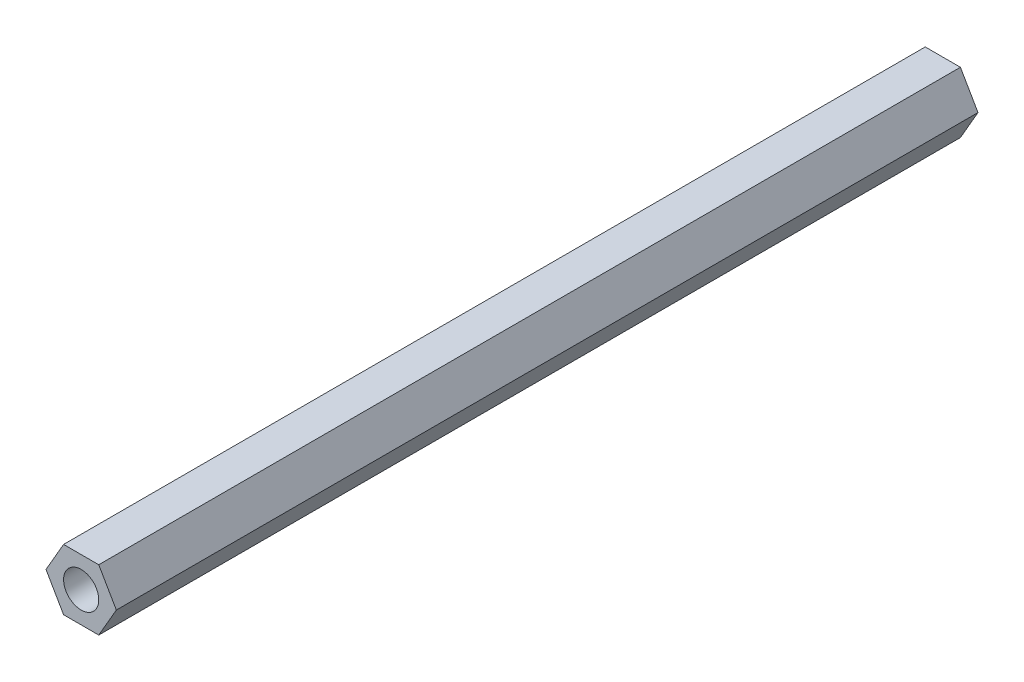
ISO-10303-21;
HEADER;
FILE_DESCRIPTION(('STEP AP214'),'2;1');
FILE_NAME('part.step','',(''),(''),'','','');
FILE_SCHEMA(('AUTOMOTIVE_DESIGN { 1 0 10303 214 1 1 1 1 }'));
ENDSEC;
DATA;
#1=APPLICATION_CONTEXT('core data for automotive mechanical design processes');
#2=APPLICATION_PROTOCOL_DEFINITION('international standard','automotive_design',2000,#1);
#3=PRODUCT_CONTEXT('',#1,'mechanical');
#4=PRODUCT('Part','Part','',(#3));
#5=PRODUCT_RELATED_PRODUCT_CATEGORY('part','',(#4));
#6=PRODUCT_DEFINITION_FORMATION('','',#4);
#7=PRODUCT_DEFINITION_CONTEXT('part definition',#1,'design');
#8=PRODUCT_DEFINITION('design','',#6,#7);
#9=PRODUCT_DEFINITION_SHAPE('','',#8);
#10=(LENGTH_UNIT() NAMED_UNIT(*) SI_UNIT(.MILLI.,.METRE.));
#11=(NAMED_UNIT(*) PLANE_ANGLE_UNIT() SI_UNIT($,.RADIAN.));
#12=(NAMED_UNIT(*) SI_UNIT($,.STERADIAN.) SOLID_ANGLE_UNIT());
#13=UNCERTAINTY_MEASURE_WITH_UNIT(LENGTH_MEASURE(1.E-05),#10,'distance_accuracy_value','');
#14=(GEOMETRIC_REPRESENTATION_CONTEXT(3) GLOBAL_UNCERTAINTY_ASSIGNED_CONTEXT((#13)) GLOBAL_UNIT_ASSIGNED_CONTEXT((#10,
#11,#12)) REPRESENTATION_CONTEXT('',''));
#15=CARTESIAN_POINT('',(0.,0.,0.));
#16=DIRECTION('',(0.,0.,1.));
#17=DIRECTION('',(1.,0.,0.));
#18=AXIS2_PLACEMENT_3D('',#15,#16,#17);
#19=CARTESIAN_POINT('',(0.,0.,98.));
#20=DIRECTION('',(0.,0.,1.));
#21=DIRECTION('',(1.,0.,0.));
#22=AXIS2_PLACEMENT_3D('',#19,#20,#21);
#23=PLANE('',#22);
#24=DIRECTION('',(0.5,0.866025403784439,0.));
#25=VECTOR('',#24,1.);
#26=CARTESIAN_POINT('',(-27.7999999999918,26.3358983848383,98.));
#27=LINE('',#26,#25);
#28=CARTESIAN_POINT('',(-27.7999999999918,26.3358983848383,98.));
#29=VERTEX_POINT('',#28);
#30=CARTESIAN_POINT('',(-25.7999999999918,29.799999999976,98.));
#31=VERTEX_POINT('',#30);
#32=EDGE_CURVE('E133',#29,#31,#27,.T.);
#33=ORIENTED_EDGE('',*,*,#32,.T.);
#34=DIRECTION('',(-0.500000000000001,0.866025403784438,0.));
#35=VECTOR('',#34,1.);
#36=CARTESIAN_POINT('',(-25.7999999999918,29.799999999976,98.));
#37=LINE('',#36,#35);
#38=CARTESIAN_POINT('',(-27.7999999999918,33.2641016151138,98.));
#39=VERTEX_POINT('',#38);
#40=EDGE_CURVE('E91',#31,#39,#37,.T.);
#41=ORIENTED_EDGE('',*,*,#40,.T.);
#42=DIRECTION('',(-1.,0.,0.));
#43=VECTOR('',#42,1.);
#44=CARTESIAN_POINT('',(-27.7999999999918,33.2641016151138,98.));
#45=LINE('',#44,#43);
#46=CARTESIAN_POINT('',(-31.7999999999918,33.2641016151138,98.));
#47=VERTEX_POINT('',#46);
#48=EDGE_CURVE('E104',#39,#47,#45,.T.);
#49=ORIENTED_EDGE('',*,*,#48,.T.);
#50=DIRECTION('',(-0.499999999999999,-0.866025403784439,0.));
#51=VECTOR('',#50,1.);
#52=CARTESIAN_POINT('',(-31.7999999999918,33.2641016151138,98.));
#53=LINE('',#52,#51);
#54=CARTESIAN_POINT('',(-33.7999999999918,29.799999999976,98.));
#55=VERTEX_POINT('',#54);
#56=EDGE_CURVE('E98',#47,#55,#53,.T.);
#57=ORIENTED_EDGE('',*,*,#56,.T.);
#58=DIRECTION('',(0.5,-0.866025403784438,0.));
#59=VECTOR('',#58,1.);
#60=CARTESIAN_POINT('',(-33.7999999999918,29.799999999976,98.));
#61=LINE('',#60,#59);
#62=CARTESIAN_POINT('',(-31.7999999999918,26.3358983848383,98.));
#63=VERTEX_POINT('',#62);
#64=EDGE_CURVE('E102',#55,#63,#61,.T.);
#65=ORIENTED_EDGE('',*,*,#64,.T.);
#66=DIRECTION('',(1.,0.,0.));
#67=VECTOR('',#66,1.);
#68=CARTESIAN_POINT('',(-31.7999999999918,26.3358983848383,98.));
#69=LINE('',#68,#67);
#70=EDGE_CURVE('E54',#63,#29,#69,.T.);
#71=ORIENTED_EDGE('',*,*,#70,.T.);
#72=EDGE_LOOP('',(#33,#41,#49,#57,#65,#71));
#73=FACE_BOUND('',#72,.T.);
#74=CARTESIAN_POINT('',(-29.7999999999919,29.7999999999762,98.));
#75=DIRECTION('',(0.,0.,1.));
#76=DIRECTION('',(1.,0.,0.));
#77=AXIS2_PLACEMENT_3D('',#74,#75,#76);
#78=CIRCLE('',#77,2.);
#79=CARTESIAN_POINT('',(-27.7999999999919,29.7999999999762,98.));
#80=VERTEX_POINT('',#79);
#81=EDGE_CURVE('E126',#80,#80,#78,.T.);
#82=ORIENTED_EDGE('',*,*,#81,.F.);
#83=EDGE_LOOP('',(#82));
#84=FACE_BOUND('',#83,.T.);
#85=ADVANCED_FACE('F37',(#73,#84),#23,.T.);
#86=CARTESIAN_POINT('',(0.,0.,0.));
#87=DIRECTION('',(0.,0.,1.));
#88=DIRECTION('',(1.,0.,0.));
#89=AXIS2_PLACEMENT_3D('',#86,#87,#88);
#90=PLANE('',#89);
#91=DIRECTION('',(0.5,0.866025403784439,0.));
#92=VECTOR('',#91,1.);
#93=CARTESIAN_POINT('',(-27.7999999999918,26.3358983848383,0.));
#94=LINE('',#93,#92);
#95=CARTESIAN_POINT('',(-27.7999999999918,26.3358983848383,0.));
#96=VERTEX_POINT('',#95);
#97=CARTESIAN_POINT('',(-25.7999999999918,29.799999999976,0.));
#98=VERTEX_POINT('',#97);
#99=EDGE_CURVE('E122',#96,#98,#94,.T.);
#100=ORIENTED_EDGE('',*,*,#99,.F.);
#101=DIRECTION('',(1.,0.,0.));
#102=VECTOR('',#101,1.);
#103=CARTESIAN_POINT('',(-31.7999999999918,26.3358983848383,0.));
#104=LINE('',#103,#102);
#105=CARTESIAN_POINT('',(-31.7999999999918,26.3358983848383,0.));
#106=VERTEX_POINT('',#105);
#107=EDGE_CURVE('E83',#106,#96,#104,.T.);
#108=ORIENTED_EDGE('',*,*,#107,.F.);
#109=DIRECTION('',(0.5,-0.866025403784438,0.));
#110=VECTOR('',#109,1.);
#111=CARTESIAN_POINT('',(-33.7999999999918,29.799999999976,0.));
#112=LINE('',#111,#110);
#113=CARTESIAN_POINT('',(-33.7999999999918,29.799999999976,0.));
#114=VERTEX_POINT('',#113);
#115=EDGE_CURVE('E77',#114,#106,#112,.T.);
#116=ORIENTED_EDGE('',*,*,#115,.F.);
#117=DIRECTION('',(-0.499999999999999,-0.866025403784439,0.));
#118=VECTOR('',#117,1.);
#119=CARTESIAN_POINT('',(-31.7999999999918,33.2641016151138,0.));
#120=LINE('',#119,#118);
#121=CARTESIAN_POINT('',(-31.7999999999918,33.2641016151138,0.));
#122=VERTEX_POINT('',#121);
#123=EDGE_CURVE('E112',#122,#114,#120,.T.);
#124=ORIENTED_EDGE('',*,*,#123,.F.);
#125=DIRECTION('',(-1.,0.,0.));
#126=VECTOR('',#125,1.);
#127=CARTESIAN_POINT('',(-27.7999999999918,33.2641016151138,0.));
#128=LINE('',#127,#126);
#129=CARTESIAN_POINT('',(-27.7999999999918,33.2641016151138,0.));
#130=VERTEX_POINT('',#129);
#131=EDGE_CURVE('E128',#130,#122,#128,.T.);
#132=ORIENTED_EDGE('',*,*,#131,.F.);
#133=DIRECTION('',(-0.500000000000001,0.866025403784438,0.));
#134=VECTOR('',#133,1.);
#135=CARTESIAN_POINT('',(-25.7999999999918,29.799999999976,0.));
#136=LINE('',#135,#134);
#137=EDGE_CURVE('E125',#98,#130,#136,.T.);
#138=ORIENTED_EDGE('',*,*,#137,.F.);
#139=EDGE_LOOP('',(#100,#108,#116,#124,#132,#138));
#140=FACE_BOUND('',#139,.T.);
#141=CARTESIAN_POINT('',(-29.7999999999919,29.7999999999762,0.));
#142=DIRECTION('',(0.,0.,1.));
#143=DIRECTION('',(1.,0.,0.));
#144=AXIS2_PLACEMENT_3D('',#141,#142,#143);
#145=CIRCLE('',#144,2.);
#146=CARTESIAN_POINT('',(-27.7999999999919,29.7999999999762,0.));
#147=VERTEX_POINT('',#146);
#148=EDGE_CURVE('E235',#147,#147,#145,.T.);
#149=ORIENTED_EDGE('',*,*,#148,.T.);
#150=EDGE_LOOP('',(#149));
#151=FACE_BOUND('',#150,.T.);
#152=ADVANCED_FACE('F142',(#140,#151),#90,.F.);
#153=CARTESIAN_POINT('',(-27.7999999999918,26.3358983848383,98.));
#154=DIRECTION('',(-0.866025403784439,0.5,0.));
#155=DIRECTION('',(-0.5,-0.866025403784439,0.));
#156=AXIS2_PLACEMENT_3D('',#153,#154,#155);
#157=PLANE('',#156);
#158=ORIENTED_EDGE('',*,*,#99,.T.);
#159=DIRECTION('',(0.,0.,-1.));
#160=VECTOR('',#159,1.);
#161=CARTESIAN_POINT('',(-25.7999999999918,29.799999999976,98.));
#162=LINE('',#161,#160);
#163=EDGE_CURVE('E11',#31,#98,#162,.T.);
#164=ORIENTED_EDGE('',*,*,#163,.F.);
#165=ORIENTED_EDGE('',*,*,#32,.F.);
#166=DIRECTION('',(0.,0.,-1.));
#167=VECTOR('',#166,1.);
#168=CARTESIAN_POINT('',(-27.7999999999918,26.3358983848383,98.));
#169=LINE('',#168,#167);
#170=EDGE_CURVE('E118',#29,#96,#169,.T.);
#171=ORIENTED_EDGE('',*,*,#170,.T.);
#172=EDGE_LOOP('',(#158,#164,#165,#171));
#173=FACE_BOUND('',#172,.T.);
#174=ADVANCED_FACE('F39',(#173),#157,.F.);
#175=CARTESIAN_POINT('',(-25.7999999999918,29.799999999976,98.));
#176=DIRECTION('',(-0.866025403784438,-0.500000000000001,0.));
#177=DIRECTION('',(0.500000000000001,-0.866025403784438,0.));
#178=AXIS2_PLACEMENT_3D('',#175,#176,#177);
#179=PLANE('',#178);
#180=ORIENTED_EDGE('',*,*,#137,.T.);
#181=DIRECTION('',(0.,0.,-1.));
#182=VECTOR('',#181,1.);
#183=CARTESIAN_POINT('',(-27.7999999999918,33.2641016151138,98.));
#184=LINE('',#183,#182);
#185=EDGE_CURVE('E46',#39,#130,#184,.T.);
#186=ORIENTED_EDGE('',*,*,#185,.F.);
#187=ORIENTED_EDGE('',*,*,#40,.F.);
#188=ORIENTED_EDGE('',*,*,#163,.T.);
#189=EDGE_LOOP('',(#180,#186,#187,#188));
#190=FACE_BOUND('',#189,.T.);
#191=ADVANCED_FACE('F167',(#190),#179,.F.);
#192=CARTESIAN_POINT('',(-27.7999999999918,33.2641016151138,98.));
#193=DIRECTION('',(0.,-1.,0.));
#194=DIRECTION('',(0.,0.,-1.));
#195=AXIS2_PLACEMENT_3D('',#192,#193,#194);
#196=PLANE('',#195);
#197=ORIENTED_EDGE('',*,*,#131,.T.);
#198=DIRECTION('',(0.,0.,-1.));
#199=VECTOR('',#198,1.);
#200=CARTESIAN_POINT('',(-31.7999999999918,33.2641016151138,98.));
#201=LINE('',#200,#199);
#202=EDGE_CURVE('E113',#47,#122,#201,.T.);
#203=ORIENTED_EDGE('',*,*,#202,.F.);
#204=ORIENTED_EDGE('',*,*,#48,.F.);
#205=ORIENTED_EDGE('',*,*,#185,.T.);
#206=EDGE_LOOP('',(#197,#203,#204,#205));
#207=FACE_BOUND('',#206,.T.);
#208=ADVANCED_FACE('F139',(#207),#196,.F.);
#209=CARTESIAN_POINT('',(-31.7999999999918,33.2641016151138,98.));
#210=DIRECTION('',(0.866025403784439,-0.499999999999999,0.));
#211=DIRECTION('',(0.5,0.866025403784439,0.));
#212=AXIS2_PLACEMENT_3D('',#209,#210,#211);
#213=PLANE('',#212);
#214=ORIENTED_EDGE('',*,*,#123,.T.);
#215=DIRECTION('',(0.,0.,-1.));
#216=VECTOR('',#215,1.);
#217=CARTESIAN_POINT('',(-33.7999999999918,29.799999999976,98.));
#218=LINE('',#217,#216);
#219=EDGE_CURVE('E109',#55,#114,#218,.T.);
#220=ORIENTED_EDGE('',*,*,#219,.F.);
#221=ORIENTED_EDGE('',*,*,#56,.F.);
#222=ORIENTED_EDGE('',*,*,#202,.T.);
#223=EDGE_LOOP('',(#214,#220,#221,#222));
#224=FACE_BOUND('',#223,.T.);
#225=ADVANCED_FACE('F110',(#224),#213,.F.);
#226=CARTESIAN_POINT('',(-33.7999999999918,29.799999999976,98.));
#227=DIRECTION('',(0.866025403784439,0.5,0.));
#228=DIRECTION('',(-0.5,0.866025403784439,0.));
#229=AXIS2_PLACEMENT_3D('',#226,#227,#228);
#230=PLANE('',#229);
#231=ORIENTED_EDGE('',*,*,#115,.T.);
#232=DIRECTION('',(0.,0.,-1.));
#233=VECTOR('',#232,1.);
#234=CARTESIAN_POINT('',(-31.7999999999918,26.3358983848383,98.));
#235=LINE('',#234,#233);
#236=EDGE_CURVE('E114',#63,#106,#235,.T.);
#237=ORIENTED_EDGE('',*,*,#236,.F.);
#238=ORIENTED_EDGE('',*,*,#64,.F.);
#239=ORIENTED_EDGE('',*,*,#219,.T.);
#240=EDGE_LOOP('',(#231,#237,#238,#239));
#241=FACE_BOUND('',#240,.T.);
#242=ADVANCED_FACE('F116',(#241),#230,.F.);
#243=CARTESIAN_POINT('',(-31.7999999999918,26.3358983848383,98.));
#244=DIRECTION('',(0.,1.,0.));
#245=DIRECTION('',(0.,0.,1.));
#246=AXIS2_PLACEMENT_3D('',#243,#244,#245);
#247=PLANE('',#246);
#248=ORIENTED_EDGE('',*,*,#107,.T.);
#249=ORIENTED_EDGE('',*,*,#170,.F.);
#250=ORIENTED_EDGE('',*,*,#70,.F.);
#251=ORIENTED_EDGE('',*,*,#236,.T.);
#252=EDGE_LOOP('',(#248,#249,#250,#251));
#253=FACE_BOUND('',#252,.T.);
#254=ADVANCED_FACE('F147',(#253),#247,.F.);
#255=CARTESIAN_POINT('',(-29.7999999999919,29.7999999999762,98.));
#256=DIRECTION('',(0.,0.,-1.));
#257=DIRECTION('',(-1.,0.,0.));
#258=AXIS2_PLACEMENT_3D('',#255,#256,#257);
#259=CYLINDRICAL_SURFACE('',#258,2.);
#260=ORIENTED_EDGE('',*,*,#81,.T.);
#261=EDGE_LOOP('',(#260));
#262=FACE_BOUND('',#261,.T.);
#263=ORIENTED_EDGE('',*,*,#148,.F.);
#264=EDGE_LOOP('',(#263));
#265=FACE_BOUND('',#264,.T.);
#266=ADVANCED_FACE('F149',(#262,#265),#259,.F.);
#267=CLOSED_SHELL('',(#85,#152,#174,#191,#208,#225,#242,#254,#266));
#268=MANIFOLD_SOLID_BREP('B2',#267);
#269=ADVANCED_BREP_SHAPE_REPRESENTATION('',(#18,#268),#14);
#270=SHAPE_DEFINITION_REPRESENTATION(#9,#269);
ENDSEC;
END-ISO-10303-21;
